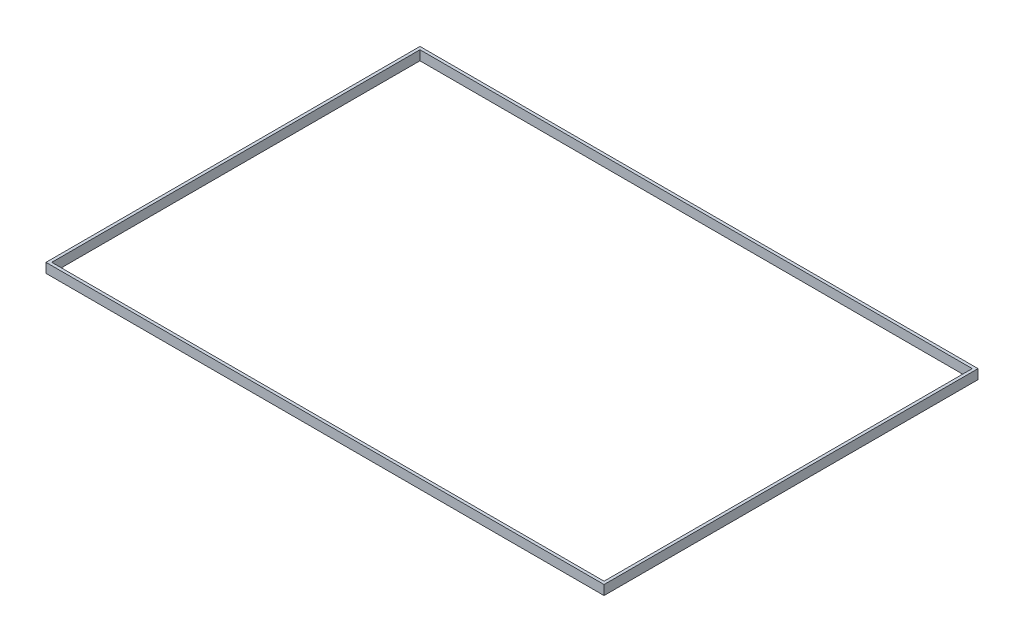
ISO-10303-21;
HEADER;
FILE_DESCRIPTION(('STEP AP214'),'2;1');
FILE_NAME('part.step','',(''),(''),'','','');
FILE_SCHEMA(('AUTOMOTIVE_DESIGN { 1 0 10303 214 1 1 1 1 }'));
ENDSEC;
DATA;
#1=APPLICATION_CONTEXT('core data for automotive mechanical design processes');
#2=APPLICATION_PROTOCOL_DEFINITION('international standard','automotive_design',2000,#1);
#3=PRODUCT_CONTEXT('',#1,'mechanical');
#4=PRODUCT('Part','Part','',(#3));
#5=PRODUCT_RELATED_PRODUCT_CATEGORY('part','',(#4));
#6=PRODUCT_DEFINITION_FORMATION('','',#4);
#7=PRODUCT_DEFINITION_CONTEXT('part definition',#1,'design');
#8=PRODUCT_DEFINITION('design','',#6,#7);
#9=PRODUCT_DEFINITION_SHAPE('','',#8);
#10=(LENGTH_UNIT() NAMED_UNIT(*) SI_UNIT(.MILLI.,.METRE.));
#11=(NAMED_UNIT(*) PLANE_ANGLE_UNIT() SI_UNIT($,.RADIAN.));
#12=(NAMED_UNIT(*) SI_UNIT($,.STERADIAN.) SOLID_ANGLE_UNIT());
#13=UNCERTAINTY_MEASURE_WITH_UNIT(LENGTH_MEASURE(1.E-05),#10,'distance_accuracy_value','');
#14=(GEOMETRIC_REPRESENTATION_CONTEXT(3) GLOBAL_UNCERTAINTY_ASSIGNED_CONTEXT((#13)) GLOBAL_UNIT_ASSIGNED_CONTEXT((#10,
#11,#12)) REPRESENTATION_CONTEXT('',''));
#15=CARTESIAN_POINT('',(0.,0.,0.));
#16=DIRECTION('',(0.,0.,1.));
#17=DIRECTION('',(1.,0.,0.));
#18=AXIS2_PLACEMENT_3D('',#15,#16,#17);
#19=CARTESIAN_POINT('',(0.,63.5,0.));
#20=DIRECTION('',(0.,-1.,0.));
#21=DIRECTION('',(0.,0.,-1.));
#22=AXIS2_PLACEMENT_3D('',#19,#20,#21);
#23=PLANE('',#22);
#24=DIRECTION('',(0.,0.,1.));
#25=VECTOR('',#24,1.);
#26=CARTESIAN_POINT('',(0.,63.5,0.));
#27=LINE('',#26,#25);
#28=CARTESIAN_POINT('',(0.,63.5,-2476.5));
#29=VERTEX_POINT('',#28);
#30=CARTESIAN_POINT('',(0.,63.5,0.));
#31=VERTEX_POINT('',#30);
#32=EDGE_CURVE('E133',#29,#31,#27,.T.);
#33=ORIENTED_EDGE('',*,*,#32,.T.);
#34=DIRECTION('',(1.,0.,0.));
#35=VECTOR('',#34,1.);
#36=CARTESIAN_POINT('',(0.,63.5,0.));
#37=LINE('',#36,#35);
#38=CARTESIAN_POINT('',(3695.7,63.5,0.));
#39=VERTEX_POINT('',#38);
#40=EDGE_CURVE('E136',#31,#39,#37,.T.);
#41=ORIENTED_EDGE('',*,*,#40,.T.);
#42=DIRECTION('',(0.,0.,-1.));
#43=VECTOR('',#42,1.);
#44=CARTESIAN_POINT('',(3695.7,63.5,0.));
#45=LINE('',#44,#43);
#46=CARTESIAN_POINT('',(3695.7,63.5,-2476.5));
#47=VERTEX_POINT('',#46);
#48=EDGE_CURVE('E139',#39,#47,#45,.T.);
#49=ORIENTED_EDGE('',*,*,#48,.T.);
#50=DIRECTION('',(-1.,0.,0.));
#51=VECTOR('',#50,1.);
#52=CARTESIAN_POINT('',(0.,63.5,-2476.5));
#53=LINE('',#52,#51);
#54=EDGE_CURVE('E141',#47,#29,#53,.T.);
#55=ORIENTED_EDGE('',*,*,#54,.T.);
#56=EDGE_LOOP('',(#33,#41,#49,#55));
#57=FACE_BOUND('',#56,.T.);
#58=DIRECTION('',(1.,0.,0.));
#59=VECTOR('',#58,1.);
#60=CARTESIAN_POINT('',(19.05,63.5,-19.05));
#61=LINE('',#60,#59);
#62=CARTESIAN_POINT('',(19.05,63.5,-19.05));
#63=VERTEX_POINT('',#62);
#64=CARTESIAN_POINT('',(3676.65,63.5,-19.05));
#65=VERTEX_POINT('',#64);
#66=EDGE_CURVE('E97',#63,#65,#61,.T.);
#67=ORIENTED_EDGE('',*,*,#66,.F.);
#68=DIRECTION('',(0.,0.,1.));
#69=VECTOR('',#68,1.);
#70=CARTESIAN_POINT('',(19.05,63.5,-19.05));
#71=LINE('',#70,#69);
#72=CARTESIAN_POINT('',(19.05,63.5,-2457.45));
#73=VERTEX_POINT('',#72);
#74=EDGE_CURVE('E119',#73,#63,#71,.T.);
#75=ORIENTED_EDGE('',*,*,#74,.F.);
#76=DIRECTION('',(-1.,0.,0.));
#77=VECTOR('',#76,1.);
#78=CARTESIAN_POINT('',(19.05,63.5,-2457.45));
#79=LINE('',#78,#77);
#80=CARTESIAN_POINT('',(3676.65,63.5,-2457.45));
#81=VERTEX_POINT('',#80);
#82=EDGE_CURVE('E117',#81,#73,#79,.T.);
#83=ORIENTED_EDGE('',*,*,#82,.F.);
#84=DIRECTION('',(0.,0.,-1.));
#85=VECTOR('',#84,1.);
#86=CARTESIAN_POINT('',(3676.65,63.5,-19.05));
#87=LINE('',#86,#85);
#88=EDGE_CURVE('E105',#65,#81,#87,.T.);
#89=ORIENTED_EDGE('',*,*,#88,.F.);
#90=EDGE_LOOP('',(#67,#75,#83,#89));
#91=FACE_BOUND('',#90,.T.);
#92=ADVANCED_FACE('F32',(#57,#91),#23,.F.);
#93=CARTESIAN_POINT('',(0.,0.,0.));
#94=DIRECTION('',(0.,-1.,0.));
#95=DIRECTION('',(0.,0.,-1.));
#96=AXIS2_PLACEMENT_3D('',#93,#94,#95);
#97=PLANE('',#96);
#98=DIRECTION('',(0.,0.,1.));
#99=VECTOR('',#98,1.);
#100=CARTESIAN_POINT('',(0.,0.,0.));
#101=LINE('',#100,#99);
#102=CARTESIAN_POINT('',(0.,0.,-2476.5));
#103=VERTEX_POINT('',#102);
#104=CARTESIAN_POINT('',(0.,0.,0.));
#105=VERTEX_POINT('',#104);
#106=EDGE_CURVE('E113',#103,#105,#101,.T.);
#107=ORIENTED_EDGE('',*,*,#106,.F.);
#108=DIRECTION('',(-1.,0.,0.));
#109=VECTOR('',#108,1.);
#110=CARTESIAN_POINT('',(0.,0.,-2476.5));
#111=LINE('',#110,#109);
#112=CARTESIAN_POINT('',(3695.7,0.,-2476.5));
#113=VERTEX_POINT('',#112);
#114=EDGE_CURVE('E137',#113,#103,#111,.T.);
#115=ORIENTED_EDGE('',*,*,#114,.F.);
#116=DIRECTION('',(0.,0.,-1.));
#117=VECTOR('',#116,1.);
#118=CARTESIAN_POINT('',(3695.7,0.,0.));
#119=LINE('',#118,#117);
#120=CARTESIAN_POINT('',(3695.7,0.,0.));
#121=VERTEX_POINT('',#120);
#122=EDGE_CURVE('E148',#121,#113,#119,.T.);
#123=ORIENTED_EDGE('',*,*,#122,.F.);
#124=DIRECTION('',(1.,0.,0.));
#125=VECTOR('',#124,1.);
#126=CARTESIAN_POINT('',(0.,0.,0.));
#127=LINE('',#126,#125);
#128=EDGE_CURVE('E146',#105,#121,#127,.T.);
#129=ORIENTED_EDGE('',*,*,#128,.F.);
#130=EDGE_LOOP('',(#107,#115,#123,#129));
#131=FACE_BOUND('',#130,.T.);
#132=DIRECTION('',(0.,0.,1.));
#133=VECTOR('',#132,1.);
#134=CARTESIAN_POINT('',(19.05,0.,-19.05));
#135=LINE('',#134,#133);
#136=CARTESIAN_POINT('',(19.05,0.,-2457.45));
#137=VERTEX_POINT('',#136);
#138=CARTESIAN_POINT('',(19.05,0.,-19.05));
#139=VERTEX_POINT('',#138);
#140=EDGE_CURVE('E106',#137,#139,#135,.T.);
#141=ORIENTED_EDGE('',*,*,#140,.T.);
#142=DIRECTION('',(1.,0.,0.));
#143=VECTOR('',#142,1.);
#144=CARTESIAN_POINT('',(19.05,0.,-19.05));
#145=LINE('',#144,#143);
#146=CARTESIAN_POINT('',(3676.65,0.,-19.05));
#147=VERTEX_POINT('',#146);
#148=EDGE_CURVE('E55',#139,#147,#145,.T.);
#149=ORIENTED_EDGE('',*,*,#148,.T.);
#150=DIRECTION('',(0.,0.,-1.));
#151=VECTOR('',#150,1.);
#152=CARTESIAN_POINT('',(3676.65,0.,-19.05));
#153=LINE('',#152,#151);
#154=CARTESIAN_POINT('',(3676.65,0.,-2457.45));
#155=VERTEX_POINT('',#154);
#156=EDGE_CURVE('E112',#147,#155,#153,.T.);
#157=ORIENTED_EDGE('',*,*,#156,.T.);
#158=DIRECTION('',(-1.,0.,0.));
#159=VECTOR('',#158,1.);
#160=CARTESIAN_POINT('',(19.05,0.,-2457.45));
#161=LINE('',#160,#159);
#162=EDGE_CURVE('E125',#155,#137,#161,.T.);
#163=ORIENTED_EDGE('',*,*,#162,.T.);
#164=EDGE_LOOP('',(#141,#149,#157,#163));
#165=FACE_BOUND('',#164,.T.);
#166=ADVANCED_FACE('F166',(#131,#165),#97,.T.);
#167=CARTESIAN_POINT('',(0.,63.5,0.));
#168=DIRECTION('',(1.,0.,0.));
#169=DIRECTION('',(0.,0.,-1.));
#170=AXIS2_PLACEMENT_3D('',#167,#168,#169);
#171=PLANE('',#170);
#172=ORIENTED_EDGE('',*,*,#106,.T.);
#173=DIRECTION('',(0.,-1.,0.));
#174=VECTOR('',#173,1.);
#175=CARTESIAN_POINT('',(0.,63.5,0.));
#176=LINE('',#175,#174);
#177=EDGE_CURVE('E11',#31,#105,#176,.T.);
#178=ORIENTED_EDGE('',*,*,#177,.F.);
#179=ORIENTED_EDGE('',*,*,#32,.F.);
#180=DIRECTION('',(0.,-1.,0.));
#181=VECTOR('',#180,1.);
#182=CARTESIAN_POINT('',(0.,63.5,-2476.5));
#183=LINE('',#182,#181);
#184=EDGE_CURVE('E143',#29,#103,#183,.T.);
#185=ORIENTED_EDGE('',*,*,#184,.T.);
#186=EDGE_LOOP('',(#172,#178,#179,#185));
#187=FACE_BOUND('',#186,.T.);
#188=ADVANCED_FACE('F34',(#187),#171,.F.);
#189=CARTESIAN_POINT('',(0.,63.5,0.));
#190=DIRECTION('',(0.,0.,-1.));
#191=DIRECTION('',(-1.,0.,0.));
#192=AXIS2_PLACEMENT_3D('',#189,#190,#191);
#193=PLANE('',#192);
#194=ORIENTED_EDGE('',*,*,#128,.T.);
#195=DIRECTION('',(0.,-1.,0.));
#196=VECTOR('',#195,1.);
#197=CARTESIAN_POINT('',(3695.7,63.5,0.));
#198=LINE('',#197,#196);
#199=EDGE_CURVE('E40',#39,#121,#198,.T.);
#200=ORIENTED_EDGE('',*,*,#199,.F.);
#201=ORIENTED_EDGE('',*,*,#40,.F.);
#202=ORIENTED_EDGE('',*,*,#177,.T.);
#203=EDGE_LOOP('',(#194,#200,#201,#202));
#204=FACE_BOUND('',#203,.T.);
#205=ADVANCED_FACE('F176',(#204),#193,.F.);
#206=CARTESIAN_POINT('',(3695.7,63.5,0.));
#207=DIRECTION('',(-1.,0.,0.));
#208=DIRECTION('',(0.,0.,1.));
#209=AXIS2_PLACEMENT_3D('',#206,#207,#208);
#210=PLANE('',#209);
#211=ORIENTED_EDGE('',*,*,#122,.T.);
#212=DIRECTION('',(0.,-1.,0.));
#213=VECTOR('',#212,1.);
#214=CARTESIAN_POINT('',(3695.7,63.5,-2476.5));
#215=LINE('',#214,#213);
#216=EDGE_CURVE('E153',#47,#113,#215,.T.);
#217=ORIENTED_EDGE('',*,*,#216,.F.);
#218=ORIENTED_EDGE('',*,*,#48,.F.);
#219=ORIENTED_EDGE('',*,*,#199,.T.);
#220=EDGE_LOOP('',(#211,#217,#218,#219));
#221=FACE_BOUND('',#220,.T.);
#222=ADVANCED_FACE('F160',(#221),#210,.F.);
#223=CARTESIAN_POINT('',(0.,63.5,-2476.5));
#224=DIRECTION('',(0.,0.,1.));
#225=DIRECTION('',(1.,0.,0.));
#226=AXIS2_PLACEMENT_3D('',#223,#224,#225);
#227=PLANE('',#226);
#228=ORIENTED_EDGE('',*,*,#114,.T.);
#229=ORIENTED_EDGE('',*,*,#184,.F.);
#230=ORIENTED_EDGE('',*,*,#54,.F.);
#231=ORIENTED_EDGE('',*,*,#216,.T.);
#232=EDGE_LOOP('',(#228,#229,#230,#231));
#233=FACE_BOUND('',#232,.T.);
#234=ADVANCED_FACE('F170',(#233),#227,.F.);
#235=CARTESIAN_POINT('',(19.05,63.5,-19.05));
#236=DIRECTION('',(0.,0.,-1.));
#237=DIRECTION('',(-1.,0.,0.));
#238=AXIS2_PLACEMENT_3D('',#235,#236,#237);
#239=PLANE('',#238);
#240=ORIENTED_EDGE('',*,*,#148,.F.);
#241=DIRECTION('',(0.,-1.,0.));
#242=VECTOR('',#241,1.);
#243=CARTESIAN_POINT('',(19.05,63.5,-19.05));
#244=LINE('',#243,#242);
#245=EDGE_CURVE('E101',#63,#139,#244,.T.);
#246=ORIENTED_EDGE('',*,*,#245,.F.);
#247=ORIENTED_EDGE('',*,*,#66,.T.);
#248=DIRECTION('',(0.,-1.,0.));
#249=VECTOR('',#248,1.);
#250=CARTESIAN_POINT('',(3676.65,63.5,-19.05));
#251=LINE('',#250,#249);
#252=EDGE_CURVE('E100',#65,#147,#251,.T.);
#253=ORIENTED_EDGE('',*,*,#252,.T.);
#254=EDGE_LOOP('',(#240,#246,#247,#253));
#255=FACE_BOUND('',#254,.T.);
#256=ADVANCED_FACE('F99',(#255),#239,.T.);
#257=CARTESIAN_POINT('',(3676.65,63.5,-19.05));
#258=DIRECTION('',(-1.,0.,0.));
#259=DIRECTION('',(0.,0.,1.));
#260=AXIS2_PLACEMENT_3D('',#257,#258,#259);
#261=PLANE('',#260);
#262=ORIENTED_EDGE('',*,*,#156,.F.);
#263=ORIENTED_EDGE('',*,*,#252,.F.);
#264=ORIENTED_EDGE('',*,*,#88,.T.);
#265=DIRECTION('',(0.,-1.,0.));
#266=VECTOR('',#265,1.);
#267=CARTESIAN_POINT('',(3676.65,63.5,-2457.45));
#268=LINE('',#267,#266);
#269=EDGE_CURVE('E114',#81,#155,#268,.T.);
#270=ORIENTED_EDGE('',*,*,#269,.T.);
#271=EDGE_LOOP('',(#262,#263,#264,#270));
#272=FACE_BOUND('',#271,.T.);
#273=ADVANCED_FACE('F109',(#272),#261,.T.);
#274=CARTESIAN_POINT('',(19.05,63.5,-2457.45));
#275=DIRECTION('',(0.,0.,1.));
#276=DIRECTION('',(1.,0.,0.));
#277=AXIS2_PLACEMENT_3D('',#274,#275,#276);
#278=PLANE('',#277);
#279=ORIENTED_EDGE('',*,*,#162,.F.);
#280=ORIENTED_EDGE('',*,*,#269,.F.);
#281=ORIENTED_EDGE('',*,*,#82,.T.);
#282=DIRECTION('',(0.,-1.,0.));
#283=VECTOR('',#282,1.);
#284=CARTESIAN_POINT('',(19.05,63.5,-2457.45));
#285=LINE('',#284,#283);
#286=EDGE_CURVE('E47',#73,#137,#285,.T.);
#287=ORIENTED_EDGE('',*,*,#286,.T.);
#288=EDGE_LOOP('',(#279,#280,#281,#287));
#289=FACE_BOUND('',#288,.T.);
#290=ADVANCED_FACE('F199',(#289),#278,.T.);
#291=CARTESIAN_POINT('',(19.05,63.5,-19.05));
#292=DIRECTION('',(1.,0.,0.));
#293=DIRECTION('',(0.,0.,-1.));
#294=AXIS2_PLACEMENT_3D('',#291,#292,#293);
#295=PLANE('',#294);
#296=ORIENTED_EDGE('',*,*,#140,.F.);
#297=ORIENTED_EDGE('',*,*,#286,.F.);
#298=ORIENTED_EDGE('',*,*,#74,.T.);
#299=ORIENTED_EDGE('',*,*,#245,.T.);
#300=EDGE_LOOP('',(#296,#297,#298,#299));
#301=FACE_BOUND('',#300,.T.);
#302=ADVANCED_FACE('F203',(#301),#295,.T.);
#303=CLOSED_SHELL('',(#92,#166,#188,#205,#222,#234,#256,#273,#290,#302));
#304=MANIFOLD_SOLID_BREP('B2',#303);
#305=ADVANCED_BREP_SHAPE_REPRESENTATION('',(#18,#304),#14);
#306=SHAPE_DEFINITION_REPRESENTATION(#9,#305);
ENDSEC;
END-ISO-10303-21;
